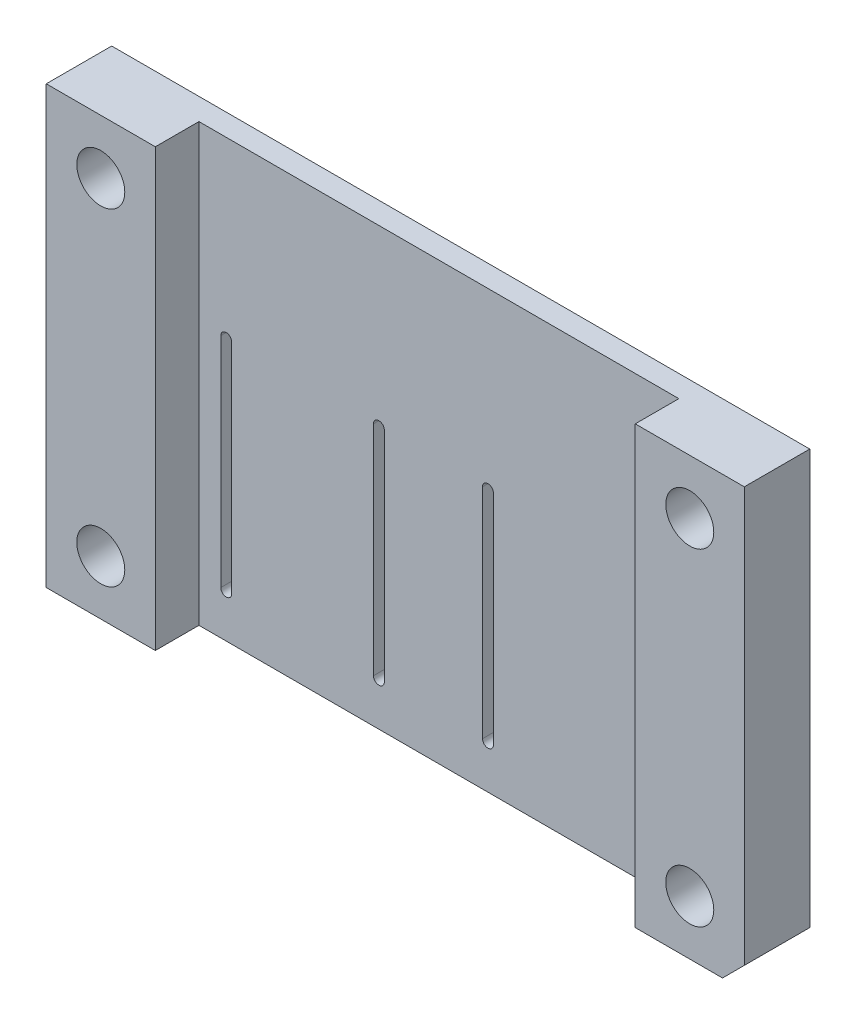
ISO-10303-21;
HEADER;
FILE_DESCRIPTION(('STEP AP214'),'2;1');
FILE_NAME('part.step','',(''),(''),'','','');
FILE_SCHEMA(('AUTOMOTIVE_DESIGN { 1 0 10303 214 1 1 1 1 }'));
ENDSEC;
DATA;
#1=APPLICATION_CONTEXT('core data for automotive mechanical design processes');
#2=APPLICATION_PROTOCOL_DEFINITION('international standard','automotive_design',2000,#1);
#3=PRODUCT_CONTEXT('',#1,'mechanical');
#4=PRODUCT('Part','Part','',(#3));
#5=PRODUCT_RELATED_PRODUCT_CATEGORY('part','',(#4));
#6=PRODUCT_DEFINITION_FORMATION('','',#4);
#7=PRODUCT_DEFINITION_CONTEXT('part definition',#1,'design');
#8=PRODUCT_DEFINITION('design','',#6,#7);
#9=PRODUCT_DEFINITION_SHAPE('','',#8);
#10=(LENGTH_UNIT() NAMED_UNIT(*) SI_UNIT(.MILLI.,.METRE.));
#11=(NAMED_UNIT(*) PLANE_ANGLE_UNIT() SI_UNIT($,.RADIAN.));
#12=(NAMED_UNIT(*) SI_UNIT($,.STERADIAN.) SOLID_ANGLE_UNIT());
#13=UNCERTAINTY_MEASURE_WITH_UNIT(LENGTH_MEASURE(1.E-05),#10,'distance_accuracy_value','');
#14=(GEOMETRIC_REPRESENTATION_CONTEXT(3) GLOBAL_UNCERTAINTY_ASSIGNED_CONTEXT((#13)) GLOBAL_UNIT_ASSIGNED_CONTEXT((#10,
#11,#12)) REPRESENTATION_CONTEXT('',''));
#15=CARTESIAN_POINT('',(0.,0.,0.));
#16=DIRECTION('',(0.,0.,1.));
#17=DIRECTION('',(1.,0.,0.));
#18=AXIS2_PLACEMENT_3D('',#15,#16,#17);
#19=CARTESIAN_POINT('',(0.,200.,30.));
#20=DIRECTION('',(0.,0.,-1.));
#21=DIRECTION('',(-1.,0.,0.));
#22=AXIS2_PLACEMENT_3D('',#19,#20,#21);
#23=PLANE('',#22);
#24=CARTESIAN_POINT('',(25.,175.,30.));
#25=DIRECTION('',(0.,0.,1.));
#26=DIRECTION('',(1.,0.,0.));
#27=AXIS2_PLACEMENT_3D('',#24,#25,#26);
#28=CIRCLE('',#27,11.);
#29=CARTESIAN_POINT('',(36.,175.,30.));
#30=VERTEX_POINT('',#29);
#31=EDGE_CURVE('E380',#30,#30,#28,.T.);
#32=ORIENTED_EDGE('',*,*,#31,.F.);
#33=EDGE_LOOP('',(#32));
#34=FACE_BOUND('',#33,.T.);
#35=CARTESIAN_POINT('',(25.,25.,30.));
#36=DIRECTION('',(0.,0.,1.));
#37=DIRECTION('',(1.,0.,0.));
#38=AXIS2_PLACEMENT_3D('',#35,#36,#37);
#39=CIRCLE('',#38,11.);
#40=CARTESIAN_POINT('',(36.,25.,30.));
#41=VERTEX_POINT('',#40);
#42=EDGE_CURVE('E368',#41,#41,#39,.T.);
#43=ORIENTED_EDGE('',*,*,#42,.F.);
#44=EDGE_LOOP('',(#43));
#45=FACE_BOUND('',#44,.T.);
#46=DIRECTION('',(1.,0.,0.));
#47=VECTOR('',#46,1.);
#48=CARTESIAN_POINT('',(0.,0.,30.));
#49=LINE('',#48,#47);
#50=CARTESIAN_POINT('',(0.,0.,30.));
#51=VERTEX_POINT('',#50);
#52=CARTESIAN_POINT('',(50.,0.,30.));
#53=VERTEX_POINT('',#52);
#54=EDGE_CURVE('E391',#51,#53,#49,.T.);
#55=ORIENTED_EDGE('',*,*,#54,.T.);
#56=DIRECTION('',(0.,-1.,0.));
#57=VECTOR('',#56,1.);
#58=CARTESIAN_POINT('',(50.,200.,30.));
#59=LINE('',#58,#57);
#60=CARTESIAN_POINT('',(50.,200.,30.));
#61=VERTEX_POINT('',#60);
#62=EDGE_CURVE('E205',#61,#53,#59,.T.);
#63=ORIENTED_EDGE('',*,*,#62,.F.);
#64=DIRECTION('',(-1.,0.,0.));
#65=VECTOR('',#64,1.);
#66=CARTESIAN_POINT('',(0.,200.,30.));
#67=LINE('',#66,#65);
#68=CARTESIAN_POINT('',(0.,200.,30.));
#69=VERTEX_POINT('',#68);
#70=EDGE_CURVE('E395',#61,#69,#67,.T.);
#71=ORIENTED_EDGE('',*,*,#70,.T.);
#72=DIRECTION('',(0.,-1.,0.));
#73=VECTOR('',#72,1.);
#74=CARTESIAN_POINT('',(0.,0.,30.));
#75=LINE('',#74,#73);
#76=EDGE_CURVE('E386',#69,#51,#75,.T.);
#77=ORIENTED_EDGE('',*,*,#76,.T.);
#78=EDGE_LOOP('',(#55,#63,#71,#77));
#79=FACE_BOUND('',#78,.T.);
#80=ADVANCED_FACE('F34',(#34,#45,#79),#23,.F.);
#81=CARTESIAN_POINT('',(257.5,120.,0.));
#82=DIRECTION('',(0.,0.,1.));
#83=DIRECTION('',(1.,0.,0.));
#84=AXIS2_PLACEMENT_3D('',#81,#82,#83);
#85=CYLINDRICAL_SURFACE('',#84,2.5);
#86=CARTESIAN_POINT('',(257.5,120.,9.99999999999999));
#87=DIRECTION('',(0.,0.,1.));
#88=DIRECTION('',(1.,0.,0.));
#89=AXIS2_PLACEMENT_3D('',#86,#87,#88);
#90=CIRCLE('',#89,2.5);
#91=CARTESIAN_POINT('',(255.,120.,9.99999999999999));
#92=VERTEX_POINT('',#91);
#93=CARTESIAN_POINT('',(260.,120.,9.99999999999999));
#94=VERTEX_POINT('',#93);
#95=EDGE_CURVE('E263',#92,#94,#90,.F.);
#96=ORIENTED_EDGE('',*,*,#95,.F.);
#97=DIRECTION('',(0.,0.,1.));
#98=VECTOR('',#97,1.);
#99=CARTESIAN_POINT('',(255.,120.,0.));
#100=LINE('',#99,#98);
#101=CARTESIAN_POINT('',(255.,120.,0.));
#102=VERTEX_POINT('',#101);
#103=EDGE_CURVE('E349',#102,#92,#100,.T.);
#104=ORIENTED_EDGE('',*,*,#103,.F.);
#105=CARTESIAN_POINT('',(257.5,120.,0.));
#106=DIRECTION('',(0.,0.,1.));
#107=DIRECTION('',(1.,0.,0.));
#108=AXIS2_PLACEMENT_3D('',#105,#106,#107);
#109=CIRCLE('',#108,2.5);
#110=CARTESIAN_POINT('',(260.,120.,0.));
#111=VERTEX_POINT('',#110);
#112=EDGE_CURVE('E329',#111,#102,#109,.T.);
#113=ORIENTED_EDGE('',*,*,#112,.F.);
#114=DIRECTION('',(0.,0.,1.));
#115=VECTOR('',#114,1.);
#116=CARTESIAN_POINT('',(260.,120.,0.));
#117=LINE('',#116,#115);
#118=EDGE_CURVE('E350',#111,#94,#117,.T.);
#119=ORIENTED_EDGE('',*,*,#118,.T.);
#120=EDGE_LOOP('',(#96,#104,#113,#119));
#121=FACE_BOUND('',#120,.T.);
#122=ADVANCED_FACE('F454',(#121),#85,.F.);
#123=CARTESIAN_POINT('',(260.,120.,0.));
#124=DIRECTION('',(1.,0.,0.));
#125=DIRECTION('',(0.,0.,-1.));
#126=AXIS2_PLACEMENT_3D('',#123,#124,#125);
#127=PLANE('',#126);
#128=DIRECTION('',(0.,-1.,0.));
#129=VECTOR('',#128,1.);
#130=CARTESIAN_POINT('',(260.,120.,9.99999999999999));
#131=LINE('',#130,#129);
#132=CARTESIAN_POINT('',(260.,20.,9.99999999999999));
#133=VERTEX_POINT('',#132);
#134=EDGE_CURVE('E261',#94,#133,#131,.T.);
#135=ORIENTED_EDGE('',*,*,#134,.F.);
#136=ORIENTED_EDGE('',*,*,#118,.F.);
#137=DIRECTION('',(0.,1.,0.));
#138=VECTOR('',#137,1.);
#139=CARTESIAN_POINT('',(260.,120.,0.));
#140=LINE('',#139,#138);
#141=CARTESIAN_POINT('',(260.,20.,0.));
#142=VERTEX_POINT('',#141);
#143=EDGE_CURVE('E346',#142,#111,#140,.T.);
#144=ORIENTED_EDGE('',*,*,#143,.F.);
#145=DIRECTION('',(0.,0.,1.));
#146=VECTOR('',#145,1.);
#147=CARTESIAN_POINT('',(260.,20.,0.));
#148=LINE('',#147,#146);
#149=EDGE_CURVE('E354',#142,#133,#148,.T.);
#150=ORIENTED_EDGE('',*,*,#149,.T.);
#151=EDGE_LOOP('',(#135,#136,#144,#150));
#152=FACE_BOUND('',#151,.T.);
#153=ADVANCED_FACE('F460',(#152),#127,.F.);
#154=CARTESIAN_POINT('',(257.5,20.,0.));
#155=DIRECTION('',(0.,0.,1.));
#156=DIRECTION('',(1.,0.,0.));
#157=AXIS2_PLACEMENT_3D('',#154,#155,#156);
#158=CYLINDRICAL_SURFACE('',#157,2.5);
#159=CARTESIAN_POINT('',(257.5,20.,9.99999999999999));
#160=DIRECTION('',(0.,0.,1.));
#161=DIRECTION('',(1.,0.,0.));
#162=AXIS2_PLACEMENT_3D('',#159,#160,#161);
#163=CIRCLE('',#162,2.5);
#164=CARTESIAN_POINT('',(255.,20.,9.99999999999999));
#165=VERTEX_POINT('',#164);
#166=EDGE_CURVE('E259',#133,#165,#163,.F.);
#167=ORIENTED_EDGE('',*,*,#166,.F.);
#168=ORIENTED_EDGE('',*,*,#149,.F.);
#169=CARTESIAN_POINT('',(257.5,20.,0.));
#170=DIRECTION('',(0.,0.,1.));
#171=DIRECTION('',(1.,0.,0.));
#172=AXIS2_PLACEMENT_3D('',#169,#170,#171);
#173=CIRCLE('',#172,2.5);
#174=CARTESIAN_POINT('',(255.,20.,0.));
#175=VERTEX_POINT('',#174);
#176=EDGE_CURVE('E343',#175,#142,#173,.T.);
#177=ORIENTED_EDGE('',*,*,#176,.F.);
#178=DIRECTION('',(0.,0.,1.));
#179=VECTOR('',#178,1.);
#180=CARTESIAN_POINT('',(255.,20.,0.));
#181=LINE('',#180,#179);
#182=EDGE_CURVE('E357',#175,#165,#181,.T.);
#183=ORIENTED_EDGE('',*,*,#182,.T.);
#184=EDGE_LOOP('',(#167,#168,#177,#183));
#185=FACE_BOUND('',#184,.T.);
#186=ADVANCED_FACE('F525',(#185),#158,.F.);
#187=CARTESIAN_POINT('',(255.,120.,0.));
#188=DIRECTION('',(-1.,0.,0.));
#189=DIRECTION('',(0.,0.,1.));
#190=AXIS2_PLACEMENT_3D('',#187,#188,#189);
#191=PLANE('',#190);
#192=DIRECTION('',(0.,1.,0.));
#193=VECTOR('',#192,1.);
#194=CARTESIAN_POINT('',(255.,120.,9.99999999999999));
#195=LINE('',#194,#193);
#196=EDGE_CURVE('E257',#165,#92,#195,.T.);
#197=ORIENTED_EDGE('',*,*,#196,.F.);
#198=ORIENTED_EDGE('',*,*,#182,.F.);
#199=DIRECTION('',(0.,-1.,0.));
#200=VECTOR('',#199,1.);
#201=CARTESIAN_POINT('',(255.,120.,0.));
#202=LINE('',#201,#200);
#203=EDGE_CURVE('E340',#102,#175,#202,.T.);
#204=ORIENTED_EDGE('',*,*,#203,.F.);
#205=ORIENTED_EDGE('',*,*,#103,.T.);
#206=EDGE_LOOP('',(#197,#198,#204,#205));
#207=FACE_BOUND('',#206,.T.);
#208=ADVANCED_FACE('F521',(#207),#191,.F.);
#209=CARTESIAN_POINT('',(182.5,120.,0.));
#210=DIRECTION('',(0.,0.,1.));
#211=DIRECTION('',(1.,0.,0.));
#212=AXIS2_PLACEMENT_3D('',#209,#210,#211);
#213=CYLINDRICAL_SURFACE('',#212,2.49999999999997);
#214=CARTESIAN_POINT('',(182.5,120.,9.99999999999999));
#215=DIRECTION('',(0.,0.,1.));
#216=DIRECTION('',(1.,0.,0.));
#217=AXIS2_PLACEMENT_3D('',#214,#215,#216);
#218=CIRCLE('',#217,2.49999999999997);
#219=CARTESIAN_POINT('',(180.,120.,9.99999999999999));
#220=VERTEX_POINT('',#219);
#221=CARTESIAN_POINT('',(185.,120.,9.99999999999999));
#222=VERTEX_POINT('',#221);
#223=EDGE_CURVE('E255',#220,#222,#218,.F.);
#224=ORIENTED_EDGE('',*,*,#223,.F.);
#225=DIRECTION('',(0.,0.,1.));
#226=VECTOR('',#225,1.);
#227=CARTESIAN_POINT('',(180.,120.,0.));
#228=LINE('',#227,#226);
#229=CARTESIAN_POINT('',(180.,120.,0.));
#230=VERTEX_POINT('',#229);
#231=EDGE_CURVE('E325',#230,#220,#228,.T.);
#232=ORIENTED_EDGE('',*,*,#231,.F.);
#233=CARTESIAN_POINT('',(182.5,120.,0.));
#234=DIRECTION('',(0.,0.,1.));
#235=DIRECTION('',(1.,0.,0.));
#236=AXIS2_PLACEMENT_3D('',#233,#234,#235);
#237=CIRCLE('',#236,2.49999999999997);
#238=CARTESIAN_POINT('',(185.,120.,0.));
#239=VERTEX_POINT('',#238);
#240=EDGE_CURVE('E305',#239,#230,#237,.T.);
#241=ORIENTED_EDGE('',*,*,#240,.F.);
#242=DIRECTION('',(0.,0.,1.));
#243=VECTOR('',#242,1.);
#244=CARTESIAN_POINT('',(185.,120.,0.));
#245=LINE('',#244,#243);
#246=EDGE_CURVE('E326',#239,#222,#245,.T.);
#247=ORIENTED_EDGE('',*,*,#246,.T.);
#248=EDGE_LOOP('',(#224,#232,#241,#247));
#249=FACE_BOUND('',#248,.T.);
#250=ADVANCED_FACE('F511',(#249),#213,.F.);
#251=CARTESIAN_POINT('',(185.,120.,0.));
#252=DIRECTION('',(1.,0.,0.));
#253=DIRECTION('',(0.,1.,0.));
#254=AXIS2_PLACEMENT_3D('',#251,#252,#253);
#255=PLANE('',#254);
#256=DIRECTION('',(0.,-1.,0.));
#257=VECTOR('',#256,1.);
#258=CARTESIAN_POINT('',(185.,120.,9.99999999999999));
#259=LINE('',#258,#257);
#260=CARTESIAN_POINT('',(185.,20.,9.99999999999999));
#261=VERTEX_POINT('',#260);
#262=EDGE_CURVE('E253',#222,#261,#259,.T.);
#263=ORIENTED_EDGE('',*,*,#262,.F.);
#264=ORIENTED_EDGE('',*,*,#246,.F.);
#265=DIRECTION('',(0.,1.,0.));
#266=VECTOR('',#265,1.);
#267=CARTESIAN_POINT('',(185.,120.,0.));
#268=LINE('',#267,#266);
#269=CARTESIAN_POINT('',(185.,20.,0.));
#270=VERTEX_POINT('',#269);
#271=EDGE_CURVE('E322',#270,#239,#268,.T.);
#272=ORIENTED_EDGE('',*,*,#271,.F.);
#273=DIRECTION('',(0.,0.,1.));
#274=VECTOR('',#273,1.);
#275=CARTESIAN_POINT('',(185.,20.,0.));
#276=LINE('',#275,#274);
#277=EDGE_CURVE('E330',#270,#261,#276,.T.);
#278=ORIENTED_EDGE('',*,*,#277,.T.);
#279=EDGE_LOOP('',(#263,#264,#272,#278));
#280=FACE_BOUND('',#279,.T.);
#281=ADVANCED_FACE('F507',(#280),#255,.F.);
#282=CARTESIAN_POINT('',(182.5,20.,0.));
#283=DIRECTION('',(0.,0.,1.));
#284=DIRECTION('',(1.,0.,0.));
#285=AXIS2_PLACEMENT_3D('',#282,#283,#284);
#286=CYLINDRICAL_SURFACE('',#285,2.49999999999993);
#287=CARTESIAN_POINT('',(182.5,20.,9.99999999999999));
#288=DIRECTION('',(0.,0.,1.));
#289=DIRECTION('',(1.,0.,0.));
#290=AXIS2_PLACEMENT_3D('',#287,#288,#289);
#291=CIRCLE('',#290,2.49999999999993);
#292=CARTESIAN_POINT('',(180.,20.,9.99999999999999));
#293=VERTEX_POINT('',#292);
#294=EDGE_CURVE('E251',#261,#293,#291,.F.);
#295=ORIENTED_EDGE('',*,*,#294,.F.);
#296=ORIENTED_EDGE('',*,*,#277,.F.);
#297=CARTESIAN_POINT('',(182.5,20.,0.));
#298=DIRECTION('',(0.,0.,1.));
#299=DIRECTION('',(1.,0.,0.));
#300=AXIS2_PLACEMENT_3D('',#297,#298,#299);
#301=CIRCLE('',#300,2.49999999999993);
#302=CARTESIAN_POINT('',(180.,20.,0.));
#303=VERTEX_POINT('',#302);
#304=EDGE_CURVE('E319',#303,#270,#301,.T.);
#305=ORIENTED_EDGE('',*,*,#304,.F.);
#306=DIRECTION('',(0.,0.,1.));
#307=VECTOR('',#306,1.);
#308=CARTESIAN_POINT('',(180.,20.,0.));
#309=LINE('',#308,#307);
#310=EDGE_CURVE('E333',#303,#293,#309,.T.);
#311=ORIENTED_EDGE('',*,*,#310,.T.);
#312=EDGE_LOOP('',(#295,#296,#305,#311));
#313=FACE_BOUND('',#312,.T.);
#314=ADVANCED_FACE('F510',(#313),#286,.F.);
#315=CARTESIAN_POINT('',(180.,120.,0.));
#316=DIRECTION('',(-1.,0.,0.));
#317=DIRECTION('',(0.,-1.,0.));
#318=AXIS2_PLACEMENT_3D('',#315,#316,#317);
#319=PLANE('',#318);
#320=DIRECTION('',(0.,1.,0.));
#321=VECTOR('',#320,1.);
#322=CARTESIAN_POINT('',(180.,120.,9.99999999999999));
#323=LINE('',#322,#321);
#324=EDGE_CURVE('E249',#293,#220,#323,.T.);
#325=ORIENTED_EDGE('',*,*,#324,.F.);
#326=ORIENTED_EDGE('',*,*,#310,.F.);
#327=DIRECTION('',(0.,-1.,0.));
#328=VECTOR('',#327,1.);
#329=CARTESIAN_POINT('',(180.,120.,0.));
#330=LINE('',#329,#328);
#331=EDGE_CURVE('E316',#230,#303,#330,.T.);
#332=ORIENTED_EDGE('',*,*,#331,.F.);
#333=ORIENTED_EDGE('',*,*,#231,.T.);
#334=EDGE_LOOP('',(#325,#326,#332,#333));
#335=FACE_BOUND('',#334,.T.);
#336=ADVANCED_FACE('F505',(#335),#319,.F.);
#337=CARTESIAN_POINT('',(62.5000000000001,120.,0.));
#338=DIRECTION('',(0.,0.,1.));
#339=DIRECTION('',(1.,0.,0.));
#340=AXIS2_PLACEMENT_3D('',#337,#338,#339);
#341=CYLINDRICAL_SURFACE('',#340,2.5);
#342=CARTESIAN_POINT('',(62.5000000000001,120.,9.99999999999999));
#343=DIRECTION('',(0.,0.,1.));
#344=DIRECTION('',(1.,0.,0.));
#345=AXIS2_PLACEMENT_3D('',#342,#343,#344);
#346=CIRCLE('',#345,2.5);
#347=CARTESIAN_POINT('',(60.0000000000001,120.,9.99999999999999));
#348=VERTEX_POINT('',#347);
#349=CARTESIAN_POINT('',(65.0000000000001,120.,9.99999999999999));
#350=VERTEX_POINT('',#349);
#351=EDGE_CURVE('E247',#348,#350,#346,.F.);
#352=ORIENTED_EDGE('',*,*,#351,.F.);
#353=DIRECTION('',(0.,0.,1.));
#354=VECTOR('',#353,1.);
#355=CARTESIAN_POINT('',(60.0000000000001,120.,0.));
#356=LINE('',#355,#354);
#357=CARTESIAN_POINT('',(60.0000000000001,120.,0.));
#358=VERTEX_POINT('',#357);
#359=EDGE_CURVE('E301',#358,#348,#356,.T.);
#360=ORIENTED_EDGE('',*,*,#359,.F.);
#361=CARTESIAN_POINT('',(62.5000000000001,120.,0.));
#362=DIRECTION('',(0.,0.,1.));
#363=DIRECTION('',(1.,0.,0.));
#364=AXIS2_PLACEMENT_3D('',#361,#362,#363);
#365=CIRCLE('',#364,2.5);
#366=CARTESIAN_POINT('',(65.0000000000001,120.,0.));
#367=VERTEX_POINT('',#366);
#368=EDGE_CURVE('E281',#367,#358,#365,.T.);
#369=ORIENTED_EDGE('',*,*,#368,.F.);
#370=DIRECTION('',(0.,0.,1.));
#371=VECTOR('',#370,1.);
#372=CARTESIAN_POINT('',(65.0000000000001,120.,0.));
#373=LINE('',#372,#371);
#374=EDGE_CURVE('E302',#367,#350,#373,.T.);
#375=ORIENTED_EDGE('',*,*,#374,.T.);
#376=EDGE_LOOP('',(#352,#360,#369,#375));
#377=FACE_BOUND('',#376,.T.);
#378=ADVANCED_FACE('F495',(#377),#341,.F.);
#379=CARTESIAN_POINT('',(65.0000000000001,120.,0.));
#380=DIRECTION('',(1.,0.,0.));
#381=DIRECTION('',(0.,1.,0.));
#382=AXIS2_PLACEMENT_3D('',#379,#380,#381);
#383=PLANE('',#382);
#384=DIRECTION('',(0.,-1.,0.));
#385=VECTOR('',#384,1.);
#386=CARTESIAN_POINT('',(65.0000000000001,120.,9.99999999999999));
#387=LINE('',#386,#385);
#388=CARTESIAN_POINT('',(65.0000000000001,20.,9.99999999999999));
#389=VERTEX_POINT('',#388);
#390=EDGE_CURVE('E245',#350,#389,#387,.T.);
#391=ORIENTED_EDGE('',*,*,#390,.F.);
#392=ORIENTED_EDGE('',*,*,#374,.F.);
#393=DIRECTION('',(0.,1.,0.));
#394=VECTOR('',#393,1.);
#395=CARTESIAN_POINT('',(65.0000000000001,120.,0.));
#396=LINE('',#395,#394);
#397=CARTESIAN_POINT('',(65.0000000000001,20.,0.));
#398=VERTEX_POINT('',#397);
#399=EDGE_CURVE('E298',#398,#367,#396,.T.);
#400=ORIENTED_EDGE('',*,*,#399,.F.);
#401=DIRECTION('',(0.,0.,1.));
#402=VECTOR('',#401,1.);
#403=CARTESIAN_POINT('',(65.0000000000001,20.,0.));
#404=LINE('',#403,#402);
#405=EDGE_CURVE('E306',#398,#389,#404,.T.);
#406=ORIENTED_EDGE('',*,*,#405,.T.);
#407=EDGE_LOOP('',(#391,#392,#400,#406));
#408=FACE_BOUND('',#407,.T.);
#409=ADVANCED_FACE('F491',(#408),#383,.F.);
#410=CARTESIAN_POINT('',(62.5000000000001,20.,0.));
#411=DIRECTION('',(0.,0.,1.));
#412=DIRECTION('',(1.,0.,0.));
#413=AXIS2_PLACEMENT_3D('',#410,#411,#412);
#414=CYLINDRICAL_SURFACE('',#413,2.50000000000002);
#415=CARTESIAN_POINT('',(62.5000000000001,20.,9.99999999999999));
#416=DIRECTION('',(0.,0.,1.));
#417=DIRECTION('',(1.,0.,0.));
#418=AXIS2_PLACEMENT_3D('',#415,#416,#417);
#419=CIRCLE('',#418,2.50000000000002);
#420=CARTESIAN_POINT('',(60.0000000000001,20.,9.99999999999999));
#421=VERTEX_POINT('',#420);
#422=EDGE_CURVE('E243',#389,#421,#419,.F.);
#423=ORIENTED_EDGE('',*,*,#422,.F.);
#424=ORIENTED_EDGE('',*,*,#405,.F.);
#425=CARTESIAN_POINT('',(62.5000000000001,20.,0.));
#426=DIRECTION('',(0.,0.,1.));
#427=DIRECTION('',(1.,0.,0.));
#428=AXIS2_PLACEMENT_3D('',#425,#426,#427);
#429=CIRCLE('',#428,2.50000000000002);
#430=CARTESIAN_POINT('',(60.0000000000001,20.,0.));
#431=VERTEX_POINT('',#430);
#432=EDGE_CURVE('E295',#431,#398,#429,.T.);
#433=ORIENTED_EDGE('',*,*,#432,.F.);
#434=DIRECTION('',(0.,0.,1.));
#435=VECTOR('',#434,1.);
#436=CARTESIAN_POINT('',(60.0000000000001,20.,0.));
#437=LINE('',#436,#435);
#438=EDGE_CURVE('E309',#431,#421,#437,.T.);
#439=ORIENTED_EDGE('',*,*,#438,.T.);
#440=EDGE_LOOP('',(#423,#424,#433,#439));
#441=FACE_BOUND('',#440,.T.);
#442=ADVANCED_FACE('F494',(#441),#414,.F.);
#443=CARTESIAN_POINT('',(60.0000000000001,120.,0.));
#444=DIRECTION('',(-1.,0.,0.));
#445=DIRECTION('',(0.,0.,1.));
#446=AXIS2_PLACEMENT_3D('',#443,#444,#445);
#447=PLANE('',#446);
#448=DIRECTION('',(0.,1.,0.));
#449=VECTOR('',#448,1.);
#450=CARTESIAN_POINT('',(60.0000000000001,120.,9.99999999999999));
#451=LINE('',#450,#449);
#452=EDGE_CURVE('E241',#421,#348,#451,.T.);
#453=ORIENTED_EDGE('',*,*,#452,.F.);
#454=ORIENTED_EDGE('',*,*,#438,.F.);
#455=DIRECTION('',(0.,-1.,0.));
#456=VECTOR('',#455,1.);
#457=CARTESIAN_POINT('',(60.0000000000001,120.,0.));
#458=LINE('',#457,#456);
#459=EDGE_CURVE('E292',#358,#431,#458,.T.);
#460=ORIENTED_EDGE('',*,*,#459,.F.);
#461=ORIENTED_EDGE('',*,*,#359,.T.);
#462=EDGE_LOOP('',(#453,#454,#460,#461));
#463=FACE_BOUND('',#462,.T.);
#464=ADVANCED_FACE('F489',(#463),#447,.F.);
#465=CARTESIAN_POINT('',(132.5,120.,0.));
#466=DIRECTION('',(0.,0.,1.));
#467=DIRECTION('',(1.,0.,0.));
#468=AXIS2_PLACEMENT_3D('',#465,#466,#467);
#469=CYLINDRICAL_SURFACE('',#468,2.5);
#470=CARTESIAN_POINT('',(132.5,120.,9.99999999999999));
#471=DIRECTION('',(0.,0.,1.));
#472=DIRECTION('',(1.,0.,0.));
#473=AXIS2_PLACEMENT_3D('',#470,#471,#472);
#474=CIRCLE('',#473,2.5);
#475=CARTESIAN_POINT('',(130.,120.,9.99999999999999));
#476=VERTEX_POINT('',#475);
#477=CARTESIAN_POINT('',(135.,120.,9.99999999999999));
#478=VERTEX_POINT('',#477);
#479=EDGE_CURVE('E239',#476,#478,#474,.F.);
#480=ORIENTED_EDGE('',*,*,#479,.F.);
#481=DIRECTION('',(0.,0.,1.));
#482=VECTOR('',#481,1.);
#483=CARTESIAN_POINT('',(130.,120.,0.));
#484=LINE('',#483,#482);
#485=CARTESIAN_POINT('',(130.,120.,0.));
#486=VERTEX_POINT('',#485);
#487=EDGE_CURVE('E277',#486,#476,#484,.T.);
#488=ORIENTED_EDGE('',*,*,#487,.F.);
#489=CARTESIAN_POINT('',(132.5,120.,0.));
#490=DIRECTION('',(0.,0.,1.));
#491=DIRECTION('',(1.,0.,0.));
#492=AXIS2_PLACEMENT_3D('',#489,#490,#491);
#493=CIRCLE('',#492,2.5);
#494=CARTESIAN_POINT('',(135.,120.,0.));
#495=VERTEX_POINT('',#494);
#496=EDGE_CURVE('E265',#495,#486,#493,.T.);
#497=ORIENTED_EDGE('',*,*,#496,.F.);
#498=DIRECTION('',(0.,0.,1.));
#499=VECTOR('',#498,1.);
#500=CARTESIAN_POINT('',(135.,120.,0.));
#501=LINE('',#500,#499);
#502=EDGE_CURVE('E278',#495,#478,#501,.T.);
#503=ORIENTED_EDGE('',*,*,#502,.T.);
#504=EDGE_LOOP('',(#480,#488,#497,#503));
#505=FACE_BOUND('',#504,.T.);
#506=ADVANCED_FACE('F486',(#505),#469,.F.);
#507=CARTESIAN_POINT('',(135.,120.,0.));
#508=DIRECTION('',(1.,0.,0.));
#509=DIRECTION('',(0.,1.,0.));
#510=AXIS2_PLACEMENT_3D('',#507,#508,#509);
#511=PLANE('',#510);
#512=DIRECTION('',(0.,-1.,0.));
#513=VECTOR('',#512,1.);
#514=CARTESIAN_POINT('',(135.,120.,9.99999999999999));
#515=LINE('',#514,#513);
#516=CARTESIAN_POINT('',(135.,20.,9.99999999999999));
#517=VERTEX_POINT('',#516);
#518=EDGE_CURVE('E237',#478,#517,#515,.T.);
#519=ORIENTED_EDGE('',*,*,#518,.F.);
#520=ORIENTED_EDGE('',*,*,#502,.F.);
#521=DIRECTION('',(0.,1.,0.));
#522=VECTOR('',#521,1.);
#523=CARTESIAN_POINT('',(135.,120.,0.));
#524=LINE('',#523,#522);
#525=CARTESIAN_POINT('',(135.,20.,0.));
#526=VERTEX_POINT('',#525);
#527=EDGE_CURVE('E274',#526,#495,#524,.T.);
#528=ORIENTED_EDGE('',*,*,#527,.F.);
#529=DIRECTION('',(0.,0.,1.));
#530=VECTOR('',#529,1.);
#531=CARTESIAN_POINT('',(135.,20.,0.));
#532=LINE('',#531,#530);
#533=EDGE_CURVE('E282',#526,#517,#532,.T.);
#534=ORIENTED_EDGE('',*,*,#533,.T.);
#535=EDGE_LOOP('',(#519,#520,#528,#534));
#536=FACE_BOUND('',#535,.T.);
#537=ADVANCED_FACE('F480',(#536),#511,.F.);
#538=CARTESIAN_POINT('',(132.5,20.,0.));
#539=DIRECTION('',(0.,0.,1.));
#540=DIRECTION('',(1.,0.,0.));
#541=AXIS2_PLACEMENT_3D('',#538,#539,#540);
#542=CYLINDRICAL_SURFACE('',#541,2.49999999999996);
#543=CARTESIAN_POINT('',(132.5,20.,9.99999999999999));
#544=DIRECTION('',(0.,0.,1.));
#545=DIRECTION('',(1.,0.,0.));
#546=AXIS2_PLACEMENT_3D('',#543,#544,#545);
#547=CIRCLE('',#546,2.49999999999996);
#548=CARTESIAN_POINT('',(130.,20.,9.99999999999999));
#549=VERTEX_POINT('',#548);
#550=EDGE_CURVE('E231',#517,#549,#547,.F.);
#551=ORIENTED_EDGE('',*,*,#550,.F.);
#552=ORIENTED_EDGE('',*,*,#533,.F.);
#553=CARTESIAN_POINT('',(132.5,20.,0.));
#554=DIRECTION('',(0.,0.,1.));
#555=DIRECTION('',(1.,0.,0.));
#556=AXIS2_PLACEMENT_3D('',#553,#554,#555);
#557=CIRCLE('',#556,2.49999999999996);
#558=CARTESIAN_POINT('',(130.,20.,0.));
#559=VERTEX_POINT('',#558);
#560=EDGE_CURVE('E271',#559,#526,#557,.T.);
#561=ORIENTED_EDGE('',*,*,#560,.F.);
#562=DIRECTION('',(0.,0.,1.));
#563=VECTOR('',#562,1.);
#564=CARTESIAN_POINT('',(130.,20.,0.));
#565=LINE('',#564,#563);
#566=EDGE_CURVE('E285',#559,#549,#565,.T.);
#567=ORIENTED_EDGE('',*,*,#566,.T.);
#568=EDGE_LOOP('',(#551,#552,#561,#567));
#569=FACE_BOUND('',#568,.T.);
#570=ADVANCED_FACE('F474',(#569),#542,.F.);
#571=CARTESIAN_POINT('',(130.,120.,0.));
#572=DIRECTION('',(-1.,0.,0.));
#573=DIRECTION('',(0.,-1.,0.));
#574=AXIS2_PLACEMENT_3D('',#571,#572,#573);
#575=PLANE('',#574);
#576=DIRECTION('',(0.,1.,0.));
#577=VECTOR('',#576,1.);
#578=CARTESIAN_POINT('',(130.,120.,9.99999999999999));
#579=LINE('',#578,#577);
#580=EDGE_CURVE('E415',#549,#476,#579,.T.);
#581=ORIENTED_EDGE('',*,*,#580,.F.);
#582=ORIENTED_EDGE('',*,*,#566,.F.);
#583=DIRECTION('',(0.,-1.,0.));
#584=VECTOR('',#583,1.);
#585=CARTESIAN_POINT('',(130.,120.,0.));
#586=LINE('',#585,#584);
#587=EDGE_CURVE('E268',#486,#559,#586,.T.);
#588=ORIENTED_EDGE('',*,*,#587,.F.);
#589=ORIENTED_EDGE('',*,*,#487,.T.);
#590=EDGE_LOOP('',(#581,#582,#588,#589));
#591=FACE_BOUND('',#590,.T.);
#592=ADVANCED_FACE('F468',(#591),#575,.F.);
#593=CARTESIAN_POINT('',(270.,0.,30.));
#594=VERTEX_POINT('',#593);
#595=CARTESIAN_POINT('',(310.,0.,30.));
#596=VERTEX_POINT('',#595);
#597=EDGE_CURVE('E389',#594,#596,#49,.T.);
#598=ORIENTED_EDGE('',*,*,#597,.T.);
#599=DIRECTION('',(-0.707106781186549,-0.707106781186546,0.));
#600=VECTOR('',#599,1.);
#601=CARTESIAN_POINT('',(320.,10.,30.));
#602=LINE('',#601,#600);
#603=CARTESIAN_POINT('',(320.,10.,30.));
#604=VERTEX_POINT('',#603);
#605=EDGE_CURVE('E11',#596,#604,#602,.F.);
#606=ORIENTED_EDGE('',*,*,#605,.T.);
#607=DIRECTION('',(0.,1.,0.));
#608=VECTOR('',#607,1.);
#609=CARTESIAN_POINT('',(320.,0.,30.));
#610=LINE('',#609,#608);
#611=CARTESIAN_POINT('',(320.,200.,30.));
#612=VERTEX_POINT('',#611);
#613=EDGE_CURVE('E393',#604,#612,#610,.T.);
#614=ORIENTED_EDGE('',*,*,#613,.T.);
#615=CARTESIAN_POINT('',(270.,200.,30.));
#616=VERTEX_POINT('',#615);
#617=EDGE_CURVE('E396',#612,#616,#67,.T.);
#618=ORIENTED_EDGE('',*,*,#617,.T.);
#619=DIRECTION('',(0.,1.,0.));
#620=VECTOR('',#619,1.);
#621=CARTESIAN_POINT('',(270.,200.,30.));
#622=LINE('',#621,#620);
#623=EDGE_CURVE('E219',#594,#616,#622,.T.);
#624=ORIENTED_EDGE('',*,*,#623,.F.);
#625=EDGE_LOOP('',(#598,#606,#614,#618,#624));
#626=FACE_BOUND('',#625,.T.);
#627=CARTESIAN_POINT('',(295.,175.,30.));
#628=DIRECTION('',(0.,0.,1.));
#629=DIRECTION('',(1.,0.,0.));
#630=AXIS2_PLACEMENT_3D('',#627,#628,#629);
#631=CIRCLE('',#630,11.);
#632=CARTESIAN_POINT('',(306.,175.,30.));
#633=VERTEX_POINT('',#632);
#634=EDGE_CURVE('E374',#633,#633,#631,.T.);
#635=ORIENTED_EDGE('',*,*,#634,.F.);
#636=EDGE_LOOP('',(#635));
#637=FACE_BOUND('',#636,.T.);
#638=CARTESIAN_POINT('',(295.,25.,30.));
#639=DIRECTION('',(0.,0.,1.));
#640=DIRECTION('',(1.,0.,0.));
#641=AXIS2_PLACEMENT_3D('',#638,#639,#640);
#642=CIRCLE('',#641,11.);
#643=CARTESIAN_POINT('',(306.,25.,30.));
#644=VERTEX_POINT('',#643);
#645=EDGE_CURVE('E362',#644,#644,#642,.T.);
#646=ORIENTED_EDGE('',*,*,#645,.F.);
#647=EDGE_LOOP('',(#646));
#648=FACE_BOUND('',#647,.T.);
#649=ADVANCED_FACE('F445',(#626,#637,#648),#23,.F.);
#650=CARTESIAN_POINT('',(0.,200.,0.));
#651=DIRECTION('',(0.,0.,-1.));
#652=DIRECTION('',(-1.,0.,0.));
#653=AXIS2_PLACEMENT_3D('',#650,#651,#652);
#654=PLANE('',#653);
#655=ORIENTED_EDGE('',*,*,#496,.T.);
#656=ORIENTED_EDGE('',*,*,#587,.T.);
#657=ORIENTED_EDGE('',*,*,#560,.T.);
#658=ORIENTED_EDGE('',*,*,#527,.T.);
#659=EDGE_LOOP('',(#655,#656,#657,#658));
#660=FACE_BOUND('',#659,.T.);
#661=ORIENTED_EDGE('',*,*,#368,.T.);
#662=ORIENTED_EDGE('',*,*,#459,.T.);
#663=ORIENTED_EDGE('',*,*,#432,.T.);
#664=ORIENTED_EDGE('',*,*,#399,.T.);
#665=EDGE_LOOP('',(#661,#662,#663,#664));
#666=FACE_BOUND('',#665,.T.);
#667=ORIENTED_EDGE('',*,*,#240,.T.);
#668=ORIENTED_EDGE('',*,*,#331,.T.);
#669=ORIENTED_EDGE('',*,*,#304,.T.);
#670=ORIENTED_EDGE('',*,*,#271,.T.);
#671=EDGE_LOOP('',(#667,#668,#669,#670));
#672=FACE_BOUND('',#671,.T.);
#673=ORIENTED_EDGE('',*,*,#112,.T.);
#674=ORIENTED_EDGE('',*,*,#203,.T.);
#675=ORIENTED_EDGE('',*,*,#176,.T.);
#676=ORIENTED_EDGE('',*,*,#143,.T.);
#677=EDGE_LOOP('',(#673,#674,#675,#676));
#678=FACE_BOUND('',#677,.T.);
#679=CARTESIAN_POINT('',(25.,25.,0.));
#680=DIRECTION('',(0.,0.,1.));
#681=DIRECTION('',(1.,0.,0.));
#682=AXIS2_PLACEMENT_3D('',#679,#680,#681);
#683=CIRCLE('',#682,11.);
#684=CARTESIAN_POINT('',(36.,25.,0.));
#685=VERTEX_POINT('',#684);
#686=EDGE_CURVE('E365',#685,#685,#683,.T.);
#687=ORIENTED_EDGE('',*,*,#686,.T.);
#688=EDGE_LOOP('',(#687));
#689=FACE_BOUND('',#688,.T.);
#690=CARTESIAN_POINT('',(25.,175.,0.));
#691=DIRECTION('',(0.,0.,1.));
#692=DIRECTION('',(1.,0.,0.));
#693=AXIS2_PLACEMENT_3D('',#690,#691,#692);
#694=CIRCLE('',#693,11.);
#695=CARTESIAN_POINT('',(36.,175.,0.));
#696=VERTEX_POINT('',#695);
#697=EDGE_CURVE('E377',#696,#696,#694,.T.);
#698=ORIENTED_EDGE('',*,*,#697,.T.);
#699=EDGE_LOOP('',(#698));
#700=FACE_BOUND('',#699,.T.);
#701=DIRECTION('',(0.,1.,0.));
#702=VECTOR('',#701,1.);
#703=CARTESIAN_POINT('',(320.,0.,0.));
#704=LINE('',#703,#702);
#705=CARTESIAN_POINT('',(320.,10.,0.));
#706=VERTEX_POINT('',#705);
#707=CARTESIAN_POINT('',(320.,200.,0.));
#708=VERTEX_POINT('',#707);
#709=EDGE_CURVE('E404',#706,#708,#704,.T.);
#710=ORIENTED_EDGE('',*,*,#709,.F.);
#711=DIRECTION('',(0.707106781186549,0.707106781186546,0.));
#712=VECTOR('',#711,1.);
#713=CARTESIAN_POINT('',(254.999999999999,-55.0000000000005,0.));
#714=LINE('',#713,#712);
#715=CARTESIAN_POINT('',(310.,0.,0.));
#716=VERTEX_POINT('',#715);
#717=EDGE_CURVE('E56',#706,#716,#714,.F.);
#718=ORIENTED_EDGE('',*,*,#717,.T.);
#719=DIRECTION('',(1.,0.,0.));
#720=VECTOR('',#719,1.);
#721=CARTESIAN_POINT('',(0.,0.,0.));
#722=LINE('',#721,#720);
#723=CARTESIAN_POINT('',(0.,0.,0.));
#724=VERTEX_POINT('',#723);
#725=EDGE_CURVE('E402',#724,#716,#722,.T.);
#726=ORIENTED_EDGE('',*,*,#725,.F.);
#727=DIRECTION('',(0.,-1.,0.));
#728=VECTOR('',#727,1.);
#729=CARTESIAN_POINT('',(0.,0.,0.));
#730=LINE('',#729,#728);
#731=CARTESIAN_POINT('',(0.,200.,0.));
#732=VERTEX_POINT('',#731);
#733=EDGE_CURVE('E383',#732,#724,#730,.T.);
#734=ORIENTED_EDGE('',*,*,#733,.F.);
#735=DIRECTION('',(-1.,0.,0.));
#736=VECTOR('',#735,1.);
#737=CARTESIAN_POINT('',(0.,200.,0.));
#738=LINE('',#737,#736);
#739=EDGE_CURVE('E390',#708,#732,#738,.T.);
#740=ORIENTED_EDGE('',*,*,#739,.F.);
#741=EDGE_LOOP('',(#710,#718,#726,#734,#740));
#742=FACE_BOUND('',#741,.T.);
#743=CARTESIAN_POINT('',(295.,175.,0.));
#744=DIRECTION('',(0.,0.,1.));
#745=DIRECTION('',(1.,0.,0.));
#746=AXIS2_PLACEMENT_3D('',#743,#744,#745);
#747=CIRCLE('',#746,11.);
#748=CARTESIAN_POINT('',(306.,175.,0.));
#749=VERTEX_POINT('',#748);
#750=EDGE_CURVE('E371',#749,#749,#747,.T.);
#751=ORIENTED_EDGE('',*,*,#750,.T.);
#752=EDGE_LOOP('',(#751));
#753=FACE_BOUND('',#752,.T.);
#754=CARTESIAN_POINT('',(295.,25.,0.));
#755=DIRECTION('',(0.,0.,1.));
#756=DIRECTION('',(1.,0.,0.));
#757=AXIS2_PLACEMENT_3D('',#754,#755,#756);
#758=CIRCLE('',#757,11.);
#759=CARTESIAN_POINT('',(306.,25.,0.));
#760=VERTEX_POINT('',#759);
#761=EDGE_CURVE('E353',#760,#760,#758,.T.);
#762=ORIENTED_EDGE('',*,*,#761,.T.);
#763=EDGE_LOOP('',(#762));
#764=FACE_BOUND('',#763,.T.);
#765=ADVANCED_FACE('F428',(#660,#666,#672,#678,#689,#700,#742,#753,#764),#654,.T.);
#766=CARTESIAN_POINT('',(0.,0.,30.));
#767=DIRECTION('',(1.,0.,0.));
#768=DIRECTION('',(0.,0.,-1.));
#769=AXIS2_PLACEMENT_3D('',#766,#767,#768);
#770=PLANE('',#769);
#771=ORIENTED_EDGE('',*,*,#733,.T.);
#772=DIRECTION('',(0.,0.,-1.));
#773=VECTOR('',#772,1.);
#774=CARTESIAN_POINT('',(0.,0.,30.));
#775=LINE('',#774,#773);
#776=EDGE_CURVE('E412',#51,#724,#775,.T.);
#777=ORIENTED_EDGE('',*,*,#776,.F.);
#778=ORIENTED_EDGE('',*,*,#76,.F.);
#779=DIRECTION('',(0.,0.,-1.));
#780=VECTOR('',#779,1.);
#781=CARTESIAN_POINT('',(0.,200.,30.));
#782=LINE('',#781,#780);
#783=EDGE_CURVE('E399',#69,#732,#782,.T.);
#784=ORIENTED_EDGE('',*,*,#783,.T.);
#785=EDGE_LOOP('',(#771,#777,#778,#784));
#786=FACE_BOUND('',#785,.T.);
#787=ADVANCED_FACE('F438',(#786),#770,.F.);
#788=CARTESIAN_POINT('',(0.,0.,30.));
#789=DIRECTION('',(0.,1.,0.));
#790=DIRECTION('',(0.,0.,1.));
#791=AXIS2_PLACEMENT_3D('',#788,#789,#790);
#792=PLANE('',#791);
#793=ORIENTED_EDGE('',*,*,#725,.T.);
#794=DIRECTION('',(0.,0.,1.));
#795=VECTOR('',#794,1.);
#796=CARTESIAN_POINT('',(310.,0.,30.));
#797=LINE('',#796,#795);
#798=EDGE_CURVE('E42',#716,#596,#797,.T.);
#799=ORIENTED_EDGE('',*,*,#798,.T.);
#800=ORIENTED_EDGE('',*,*,#597,.F.);
#801=DIRECTION('',(0.,0.,1.));
#802=VECTOR('',#801,1.);
#803=CARTESIAN_POINT('',(270.,0.,9.99999999999999));
#804=LINE('',#803,#802);
#805=CARTESIAN_POINT('',(270.,0.,9.99999999999999));
#806=VERTEX_POINT('',#805);
#807=EDGE_CURVE('E208',#806,#594,#804,.T.);
#808=ORIENTED_EDGE('',*,*,#807,.F.);
#809=DIRECTION('',(1.,0.,0.));
#810=VECTOR('',#809,1.);
#811=CARTESIAN_POINT('',(50.,0.,9.99999999999999));
#812=LINE('',#811,#810);
#813=CARTESIAN_POINT('',(50.,0.,9.99999999999999));
#814=VERTEX_POINT('',#813);
#815=EDGE_CURVE('E215',#814,#806,#812,.T.);
#816=ORIENTED_EDGE('',*,*,#815,.F.);
#817=DIRECTION('',(0.,0.,1.));
#818=VECTOR('',#817,1.);
#819=CARTESIAN_POINT('',(50.,0.,9.99999999999999));
#820=LINE('',#819,#818);
#821=EDGE_CURVE('E199',#814,#53,#820,.T.);
#822=ORIENTED_EDGE('',*,*,#821,.T.);
#823=ORIENTED_EDGE('',*,*,#54,.F.);
#824=ORIENTED_EDGE('',*,*,#776,.T.);
#825=EDGE_LOOP('',(#793,#799,#800,#808,#816,#822,#823,#824));
#826=FACE_BOUND('',#825,.T.);
#827=ADVANCED_FACE('F221',(#826),#792,.F.);
#828=CARTESIAN_POINT('',(320.,0.,30.));
#829=DIRECTION('',(-1.,0.,0.));
#830=DIRECTION('',(0.,0.,1.));
#831=AXIS2_PLACEMENT_3D('',#828,#829,#830);
#832=PLANE('',#831);
#833=ORIENTED_EDGE('',*,*,#613,.F.);
#834=DIRECTION('',(0.,0.,-1.));
#835=VECTOR('',#834,1.);
#836=CARTESIAN_POINT('',(320.,10.,30.));
#837=LINE('',#836,#835);
#838=EDGE_CURVE('E417',#604,#706,#837,.T.);
#839=ORIENTED_EDGE('',*,*,#838,.T.);
#840=ORIENTED_EDGE('',*,*,#709,.T.);
#841=DIRECTION('',(0.,0.,-1.));
#842=VECTOR('',#841,1.);
#843=CARTESIAN_POINT('',(320.,200.,30.));
#844=LINE('',#843,#842);
#845=EDGE_CURVE('E409',#612,#708,#844,.T.);
#846=ORIENTED_EDGE('',*,*,#845,.F.);
#847=EDGE_LOOP('',(#833,#839,#840,#846));
#848=FACE_BOUND('',#847,.T.);
#849=ADVANCED_FACE('F423',(#848),#832,.F.);
#850=CARTESIAN_POINT('',(0.,200.,30.));
#851=DIRECTION('',(0.,-1.,0.));
#852=DIRECTION('',(0.,0.,-1.));
#853=AXIS2_PLACEMENT_3D('',#850,#851,#852);
#854=PLANE('',#853);
#855=ORIENTED_EDGE('',*,*,#70,.F.);
#856=DIRECTION('',(0.,0.,1.));
#857=VECTOR('',#856,1.);
#858=CARTESIAN_POINT('',(50.,200.,9.99999999999999));
#859=LINE('',#858,#857);
#860=CARTESIAN_POINT('',(50.,200.,9.99999999999999));
#861=VERTEX_POINT('',#860);
#862=EDGE_CURVE('E229',#861,#61,#859,.T.);
#863=ORIENTED_EDGE('',*,*,#862,.F.);
#864=DIRECTION('',(-1.,0.,0.));
#865=VECTOR('',#864,1.);
#866=CARTESIAN_POINT('',(50.,200.,9.99999999999999));
#867=LINE('',#866,#865);
#868=CARTESIAN_POINT('',(270.,200.,9.99999999999999));
#869=VERTEX_POINT('',#868);
#870=EDGE_CURVE('E209',#869,#861,#867,.T.);
#871=ORIENTED_EDGE('',*,*,#870,.F.);
#872=DIRECTION('',(0.,0.,1.));
#873=VECTOR('',#872,1.);
#874=CARTESIAN_POINT('',(270.,200.,9.99999999999999));
#875=LINE('',#874,#873);
#876=EDGE_CURVE('E232',#869,#616,#875,.T.);
#877=ORIENTED_EDGE('',*,*,#876,.T.);
#878=ORIENTED_EDGE('',*,*,#617,.F.);
#879=ORIENTED_EDGE('',*,*,#845,.T.);
#880=ORIENTED_EDGE('',*,*,#739,.T.);
#881=ORIENTED_EDGE('',*,*,#783,.F.);
#882=EDGE_LOOP('',(#855,#863,#871,#877,#878,#879,#880,#881));
#883=FACE_BOUND('',#882,.T.);
#884=ADVANCED_FACE('F434',(#883),#854,.F.);
#885=CARTESIAN_POINT('',(25.,175.,30.));
#886=DIRECTION('',(0.,0.,-1.));
#887=DIRECTION('',(-1.,0.,0.));
#888=AXIS2_PLACEMENT_3D('',#885,#886,#887);
#889=CYLINDRICAL_SURFACE('',#888,11.);
#890=ORIENTED_EDGE('',*,*,#31,.T.);
#891=EDGE_LOOP('',(#890));
#892=FACE_BOUND('',#891,.T.);
#893=ORIENTED_EDGE('',*,*,#697,.F.);
#894=EDGE_LOOP('',(#893));
#895=FACE_BOUND('',#894,.T.);
#896=ADVANCED_FACE('F543',(#892,#895),#889,.F.);
#897=CARTESIAN_POINT('',(295.,175.,30.));
#898=DIRECTION('',(0.,0.,-1.));
#899=DIRECTION('',(-1.,0.,0.));
#900=AXIS2_PLACEMENT_3D('',#897,#898,#899);
#901=CYLINDRICAL_SURFACE('',#900,11.);
#902=ORIENTED_EDGE('',*,*,#634,.T.);
#903=EDGE_LOOP('',(#902));
#904=FACE_BOUND('',#903,.T.);
#905=ORIENTED_EDGE('',*,*,#750,.F.);
#906=EDGE_LOOP('',(#905));
#907=FACE_BOUND('',#906,.T.);
#908=ADVANCED_FACE('F540',(#904,#907),#901,.F.);
#909=CARTESIAN_POINT('',(25.,25.,30.));
#910=DIRECTION('',(0.,0.,-1.));
#911=DIRECTION('',(-1.,0.,0.));
#912=AXIS2_PLACEMENT_3D('',#909,#910,#911);
#913=CYLINDRICAL_SURFACE('',#912,11.);
#914=ORIENTED_EDGE('',*,*,#42,.T.);
#915=EDGE_LOOP('',(#914));
#916=FACE_BOUND('',#915,.T.);
#917=ORIENTED_EDGE('',*,*,#686,.F.);
#918=EDGE_LOOP('',(#917));
#919=FACE_BOUND('',#918,.T.);
#920=ADVANCED_FACE('F536',(#916,#919),#913,.F.);
#921=CARTESIAN_POINT('',(295.,25.,30.));
#922=DIRECTION('',(0.,0.,-1.));
#923=DIRECTION('',(-1.,0.,0.));
#924=AXIS2_PLACEMENT_3D('',#921,#922,#923);
#925=CYLINDRICAL_SURFACE('',#924,11.);
#926=ORIENTED_EDGE('',*,*,#645,.T.);
#927=EDGE_LOOP('',(#926));
#928=FACE_BOUND('',#927,.T.);
#929=ORIENTED_EDGE('',*,*,#761,.F.);
#930=EDGE_LOOP('',(#929));
#931=FACE_BOUND('',#930,.T.);
#932=ADVANCED_FACE('F533',(#928,#931),#925,.F.);
#933=CARTESIAN_POINT('',(50.,0.,9.99999999999999));
#934=DIRECTION('',(0.,0.,1.));
#935=DIRECTION('',(1.,0.,0.));
#936=AXIS2_PLACEMENT_3D('',#933,#934,#935);
#937=PLANE('',#936);
#938=ORIENTED_EDGE('',*,*,#223,.T.);
#939=ORIENTED_EDGE('',*,*,#262,.T.);
#940=ORIENTED_EDGE('',*,*,#294,.T.);
#941=ORIENTED_EDGE('',*,*,#324,.T.);
#942=EDGE_LOOP('',(#938,#939,#940,#941));
#943=FACE_BOUND('',#942,.T.);
#944=ORIENTED_EDGE('',*,*,#479,.T.);
#945=ORIENTED_EDGE('',*,*,#518,.T.);
#946=ORIENTED_EDGE('',*,*,#550,.T.);
#947=ORIENTED_EDGE('',*,*,#580,.T.);
#948=EDGE_LOOP('',(#944,#945,#946,#947));
#949=FACE_BOUND('',#948,.T.);
#950=DIRECTION('',(0.,-1.,0.));
#951=VECTOR('',#950,1.);
#952=CARTESIAN_POINT('',(50.,200.,9.99999999999999));
#953=LINE('',#952,#951);
#954=EDGE_CURVE('E202',#861,#814,#953,.T.);
#955=ORIENTED_EDGE('',*,*,#954,.T.);
#956=ORIENTED_EDGE('',*,*,#815,.T.);
#957=DIRECTION('',(0.,1.,0.));
#958=VECTOR('',#957,1.);
#959=CARTESIAN_POINT('',(270.,200.,9.99999999999999));
#960=LINE('',#959,#958);
#961=EDGE_CURVE('E222',#806,#869,#960,.T.);
#962=ORIENTED_EDGE('',*,*,#961,.T.);
#963=ORIENTED_EDGE('',*,*,#870,.T.);
#964=EDGE_LOOP('',(#955,#956,#962,#963));
#965=FACE_BOUND('',#964,.T.);
#966=ORIENTED_EDGE('',*,*,#351,.T.);
#967=ORIENTED_EDGE('',*,*,#390,.T.);
#968=ORIENTED_EDGE('',*,*,#422,.T.);
#969=ORIENTED_EDGE('',*,*,#452,.T.);
#970=EDGE_LOOP('',(#966,#967,#968,#969));
#971=FACE_BOUND('',#970,.T.);
#972=ORIENTED_EDGE('',*,*,#95,.T.);
#973=ORIENTED_EDGE('',*,*,#134,.T.);
#974=ORIENTED_EDGE('',*,*,#166,.T.);
#975=ORIENTED_EDGE('',*,*,#196,.T.);
#976=EDGE_LOOP('',(#972,#973,#974,#975));
#977=FACE_BOUND('',#976,.T.);
#978=ADVANCED_FACE('F213',(#943,#949,#965,#971,#977),#937,.T.);
#979=CARTESIAN_POINT('',(50.,200.,9.99999999999999));
#980=DIRECTION('',(-1.,0.,0.));
#981=DIRECTION('',(0.,-1.,0.));
#982=AXIS2_PLACEMENT_3D('',#979,#980,#981);
#983=PLANE('',#982);
#984=ORIENTED_EDGE('',*,*,#62,.T.);
#985=ORIENTED_EDGE('',*,*,#821,.F.);
#986=ORIENTED_EDGE('',*,*,#954,.F.);
#987=ORIENTED_EDGE('',*,*,#862,.T.);
#988=EDGE_LOOP('',(#984,#985,#986,#987));
#989=FACE_BOUND('',#988,.T.);
#990=ADVANCED_FACE('F201',(#989),#983,.F.);
#991=CARTESIAN_POINT('',(270.,200.,9.99999999999999));
#992=DIRECTION('',(1.,0.,0.));
#993=DIRECTION('',(0.,0.,-1.));
#994=AXIS2_PLACEMENT_3D('',#991,#992,#993);
#995=PLANE('',#994);
#996=ORIENTED_EDGE('',*,*,#623,.T.);
#997=ORIENTED_EDGE('',*,*,#876,.F.);
#998=ORIENTED_EDGE('',*,*,#961,.F.);
#999=ORIENTED_EDGE('',*,*,#807,.T.);
#1000=EDGE_LOOP('',(#996,#997,#998,#999));
#1001=FACE_BOUND('',#1000,.T.);
#1002=ADVANCED_FACE('F448',(#1001),#995,.F.);
#1003=CARTESIAN_POINT('',(320.,10.,30.));
#1004=DIRECTION('',(-0.707106781186545,0.707106781186549,0.));
#1005=DIRECTION('',(-0.707106781186549,-0.707106781186546,0.));
#1006=AXIS2_PLACEMENT_3D('',#1003,#1004,#1005);
#1007=PLANE('',#1006);
#1008=ORIENTED_EDGE('',*,*,#605,.F.);
#1009=ORIENTED_EDGE('',*,*,#798,.F.);
#1010=ORIENTED_EDGE('',*,*,#717,.F.);
#1011=ORIENTED_EDGE('',*,*,#838,.F.);
#1012=EDGE_LOOP('',(#1008,#1009,#1010,#1011));
#1013=FACE_BOUND('',#1012,.T.);
#1014=ADVANCED_FACE('F36',(#1013),#1007,.F.);
#1015=CLOSED_SHELL('',(#80,#122,#153,#186,#208,#250,#281,#314,#336,#378,#409,#442,#464,#506,
#537,#570,#592,#649,#765,#787,#827,#849,#884,#896,#908,#920,#932,#978,#990,#1002,#1014));
#1016=MANIFOLD_SOLID_BREP('B2',#1015);
#1017=ADVANCED_BREP_SHAPE_REPRESENTATION('',(#18,#1016),#14);
#1018=SHAPE_DEFINITION_REPRESENTATION(#9,#1017);
ENDSEC;
END-ISO-10303-21;
